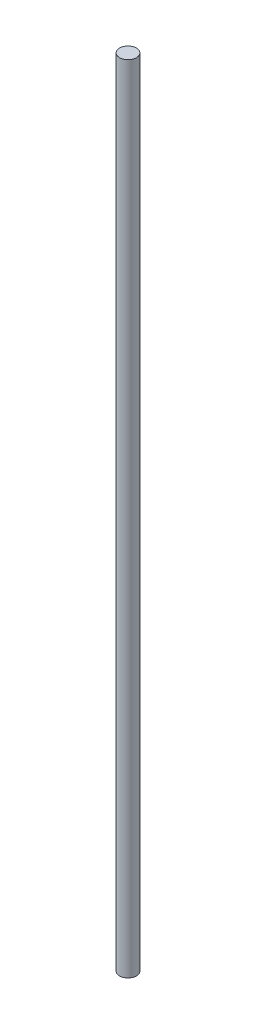
ISO-10303-21;
HEADER;
FILE_DESCRIPTION(('STEP AP214'),'2;1');
FILE_NAME('part.step','',(''),(''),'','','');
FILE_SCHEMA(('AUTOMOTIVE_DESIGN { 1 0 10303 214 1 1 1 1 }'));
ENDSEC;
DATA;
#1=APPLICATION_CONTEXT('core data for automotive mechanical design processes');
#2=APPLICATION_PROTOCOL_DEFINITION('international standard','automotive_design',2000,#1);
#3=PRODUCT_CONTEXT('',#1,'mechanical');
#4=PRODUCT('Part','Part','',(#3));
#5=PRODUCT_RELATED_PRODUCT_CATEGORY('part','',(#4));
#6=PRODUCT_DEFINITION_FORMATION('','',#4);
#7=PRODUCT_DEFINITION_CONTEXT('part definition',#1,'design');
#8=PRODUCT_DEFINITION('design','',#6,#7);
#9=PRODUCT_DEFINITION_SHAPE('','',#8);
#10=(LENGTH_UNIT() NAMED_UNIT(*) SI_UNIT(.MILLI.,.METRE.));
#11=(NAMED_UNIT(*) PLANE_ANGLE_UNIT() SI_UNIT($,.RADIAN.));
#12=(NAMED_UNIT(*) SI_UNIT($,.STERADIAN.) SOLID_ANGLE_UNIT());
#13=UNCERTAINTY_MEASURE_WITH_UNIT(LENGTH_MEASURE(1.E-05),#10,'distance_accuracy_value','');
#14=(GEOMETRIC_REPRESENTATION_CONTEXT(3) GLOBAL_UNCERTAINTY_ASSIGNED_CONTEXT((#13)) GLOBAL_UNIT_ASSIGNED_CONTEXT((#10,
#11,#12)) REPRESENTATION_CONTEXT('',''));
#15=CARTESIAN_POINT('',(0.,0.,0.));
#16=DIRECTION('',(0.,0.,1.));
#17=DIRECTION('',(1.,0.,0.));
#18=AXIS2_PLACEMENT_3D('',#15,#16,#17);
#19=CARTESIAN_POINT('',(0.,379.1,0.));
#20=DIRECTION('',(0.,-1.,0.));
#21=DIRECTION('',(0.,0.,-1.));
#22=AXIS2_PLACEMENT_3D('',#19,#20,#21);
#23=CYLINDRICAL_SURFACE('',#22,4.);
#24=CARTESIAN_POINT('',(0.,379.1,0.));
#25=DIRECTION('',(0.,1.,0.));
#26=DIRECTION('',(0.,0.,1.));
#27=AXIS2_PLACEMENT_3D('',#24,#25,#26);
#28=CIRCLE('',#27,4.);
#29=CARTESIAN_POINT('',(0.,379.1,4.));
#30=VERTEX_POINT('',#29);
#31=EDGE_CURVE('E10',#30,#30,#28,.T.);
#32=ORIENTED_EDGE('',*,*,#31,.F.);
#33=EDGE_LOOP('',(#32));
#34=FACE_BOUND('',#33,.T.);
#35=CARTESIAN_POINT('',(0.,0.,0.));
#36=DIRECTION('',(0.,1.,0.));
#37=DIRECTION('',(0.,0.,1.));
#38=AXIS2_PLACEMENT_3D('',#35,#36,#37);
#39=CIRCLE('',#38,4.);
#40=CARTESIAN_POINT('',(0.,0.,4.));
#41=VERTEX_POINT('',#40);
#42=EDGE_CURVE('E31',#41,#41,#39,.T.);
#43=ORIENTED_EDGE('',*,*,#42,.T.);
#44=EDGE_LOOP('',(#43));
#45=FACE_BOUND('',#44,.T.);
#46=ADVANCED_FACE('F28',(#34,#45),#23,.T.);
#47=CARTESIAN_POINT('',(0.,379.1,0.));
#48=DIRECTION('',(0.,1.,0.));
#49=DIRECTION('',(0.,0.,1.));
#50=AXIS2_PLACEMENT_3D('',#47,#48,#49);
#51=PLANE('',#50);
#52=ORIENTED_EDGE('',*,*,#31,.T.);
#53=EDGE_LOOP('',(#52));
#54=FACE_BOUND('',#53,.T.);
#55=ADVANCED_FACE('F43',(#54),#51,.T.);
#56=CARTESIAN_POINT('',(0.,0.,0.));
#57=DIRECTION('',(0.,1.,0.));
#58=DIRECTION('',(0.,0.,1.));
#59=AXIS2_PLACEMENT_3D('',#56,#57,#58);
#60=PLANE('',#59);
#61=ORIENTED_EDGE('',*,*,#42,.F.);
#62=EDGE_LOOP('',(#61));
#63=FACE_BOUND('',#62,.T.);
#64=ADVANCED_FACE('F41',(#63),#60,.F.);
#65=CLOSED_SHELL('',(#46,#55,#64));
#66=MANIFOLD_SOLID_BREP('B2',#65);
#67=ADVANCED_BREP_SHAPE_REPRESENTATION('',(#18,#66),#14);
#68=SHAPE_DEFINITION_REPRESENTATION(#9,#67);
ENDSEC;
END-ISO-10303-21;
